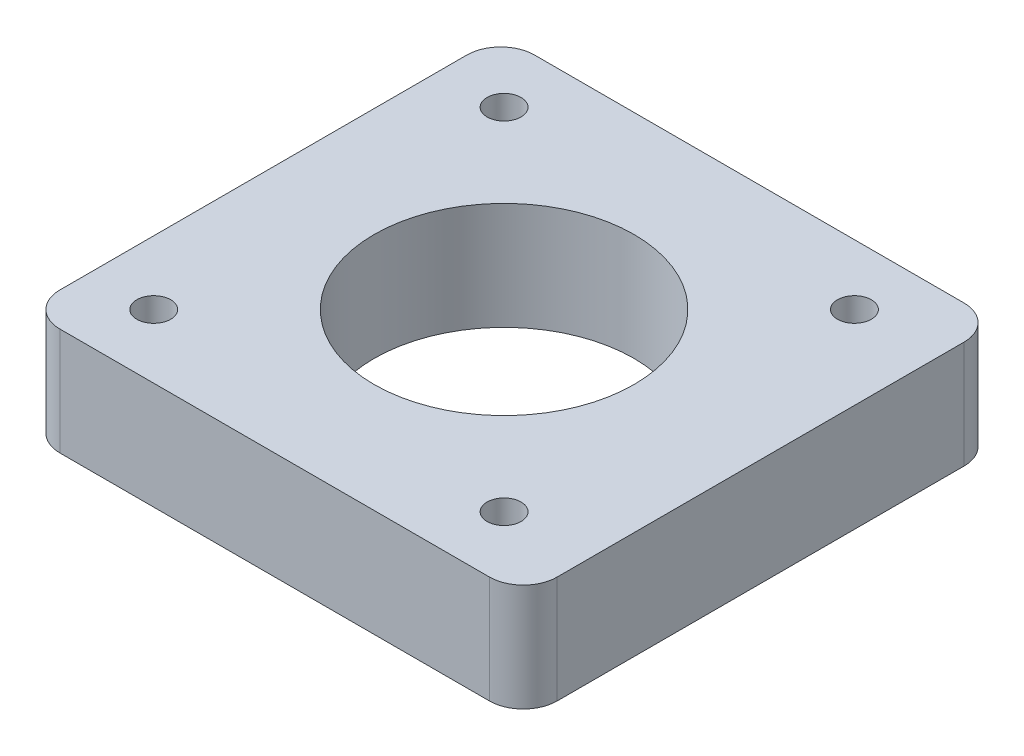
ISO-10303-21;
HEADER;
FILE_DESCRIPTION(('STEP AP214'),'2;1');
FILE_NAME('part.step','',(''),(''),'','','');
FILE_SCHEMA(('AUTOMOTIVE_DESIGN { 1 0 10303 214 1 1 1 1 }'));
ENDSEC;
DATA;
#1=APPLICATION_CONTEXT('core data for automotive mechanical design processes');
#2=APPLICATION_PROTOCOL_DEFINITION('international standard','automotive_design',2000,#1);
#3=PRODUCT_CONTEXT('',#1,'mechanical');
#4=PRODUCT('Part','Part','',(#3));
#5=PRODUCT_RELATED_PRODUCT_CATEGORY('part','',(#4));
#6=PRODUCT_DEFINITION_FORMATION('','',#4);
#7=PRODUCT_DEFINITION_CONTEXT('part definition',#1,'design');
#8=PRODUCT_DEFINITION('design','',#6,#7);
#9=PRODUCT_DEFINITION_SHAPE('','',#8);
#10=(LENGTH_UNIT() NAMED_UNIT(*) SI_UNIT(.MILLI.,.METRE.));
#11=(NAMED_UNIT(*) PLANE_ANGLE_UNIT() SI_UNIT($,.RADIAN.));
#12=(NAMED_UNIT(*) SI_UNIT($,.STERADIAN.) SOLID_ANGLE_UNIT());
#13=UNCERTAINTY_MEASURE_WITH_UNIT(LENGTH_MEASURE(1.E-05),#10,'distance_accuracy_value','');
#14=(GEOMETRIC_REPRESENTATION_CONTEXT(3) GLOBAL_UNCERTAINTY_ASSIGNED_CONTEXT((#13)) GLOBAL_UNIT_ASSIGNED_CONTEXT((#10,
#11,#12)) REPRESENTATION_CONTEXT('',''));
#15=CARTESIAN_POINT('',(0.,0.,0.));
#16=DIRECTION('',(0.,0.,1.));
#17=DIRECTION('',(1.,0.,0.));
#18=AXIS2_PLACEMENT_3D('',#15,#16,#17);
#19=CARTESIAN_POINT('',(0.,9.5,0.));
#20=DIRECTION('',(1.,0.,0.));
#21=DIRECTION('',(0.,0.,-1.));
#22=AXIS2_PLACEMENT_3D('',#19,#20,#21);
#23=PLANE('',#22);
#24=DIRECTION('',(0.,0.,1.));
#25=VECTOR('',#24,1.);
#26=CARTESIAN_POINT('',(0.,9.5,0.));
#27=LINE('',#26,#25);
#28=CARTESIAN_POINT('',(0.,9.5,3.));
#29=VERTEX_POINT('',#28);
#30=CARTESIAN_POINT('',(0.,9.5,39.));
#31=VERTEX_POINT('',#30);
#32=EDGE_CURVE('E127',#29,#31,#27,.T.);
#33=ORIENTED_EDGE('',*,*,#32,.F.);
#34=DIRECTION('',(0.,-1.,0.));
#35=VECTOR('',#34,1.);
#36=CARTESIAN_POINT('',(0.,9.5,3.));
#37=LINE('',#36,#35);
#38=CARTESIAN_POINT('',(0.,0.,3.));
#39=VERTEX_POINT('',#38);
#40=EDGE_CURVE('E153',#29,#39,#37,.T.);
#41=ORIENTED_EDGE('',*,*,#40,.T.);
#42=DIRECTION('',(0.,0.,1.));
#43=VECTOR('',#42,1.);
#44=CARTESIAN_POINT('',(0.,0.,0.));
#45=LINE('',#44,#43);
#46=CARTESIAN_POINT('',(0.,0.,39.));
#47=VERTEX_POINT('',#46);
#48=EDGE_CURVE('E159',#39,#47,#45,.T.);
#49=ORIENTED_EDGE('',*,*,#48,.T.);
#50=DIRECTION('',(0.,-1.,0.));
#51=VECTOR('',#50,1.);
#52=CARTESIAN_POINT('',(0.,9.5,39.));
#53=LINE('',#52,#51);
#54=EDGE_CURVE('E151',#47,#31,#53,.F.);
#55=ORIENTED_EDGE('',*,*,#54,.T.);
#56=EDGE_LOOP('',(#33,#41,#49,#55));
#57=FACE_BOUND('',#56,.T.);
#58=ADVANCED_FACE('F35',(#57),#23,.F.);
#59=CARTESIAN_POINT('',(0.,9.5,42.));
#60=DIRECTION('',(0.,0.,-1.));
#61=DIRECTION('',(-1.,0.,0.));
#62=AXIS2_PLACEMENT_3D('',#59,#60,#61);
#63=PLANE('',#62);
#64=DIRECTION('',(1.,0.,0.));
#65=VECTOR('',#64,1.);
#66=CARTESIAN_POINT('',(0.,9.5,42.));
#67=LINE('',#66,#65);
#68=CARTESIAN_POINT('',(3.,9.5,42.));
#69=VERTEX_POINT('',#68);
#70=CARTESIAN_POINT('',(41.,9.5,42.));
#71=VERTEX_POINT('',#70);
#72=EDGE_CURVE('E130',#69,#71,#67,.T.);
#73=ORIENTED_EDGE('',*,*,#72,.F.);
#74=DIRECTION('',(0.,-1.,0.));
#75=VECTOR('',#74,1.);
#76=CARTESIAN_POINT('',(3.,9.5,42.));
#77=LINE('',#76,#75);
#78=CARTESIAN_POINT('',(3.,0.,42.));
#79=VERTEX_POINT('',#78);
#80=EDGE_CURVE('E11',#69,#79,#77,.T.);
#81=ORIENTED_EDGE('',*,*,#80,.T.);
#82=DIRECTION('',(1.,0.,0.));
#83=VECTOR('',#82,1.);
#84=CARTESIAN_POINT('',(0.,0.,42.));
#85=LINE('',#84,#83);
#86=CARTESIAN_POINT('',(41.,0.,42.));
#87=VERTEX_POINT('',#86);
#88=EDGE_CURVE('E132',#79,#87,#85,.T.);
#89=ORIENTED_EDGE('',*,*,#88,.T.);
#90=DIRECTION('',(0.,-1.,0.));
#91=VECTOR('',#90,1.);
#92=CARTESIAN_POINT('',(41.,9.5,42.));
#93=LINE('',#92,#91);
#94=EDGE_CURVE('E43',#87,#71,#93,.F.);
#95=ORIENTED_EDGE('',*,*,#94,.T.);
#96=EDGE_LOOP('',(#73,#81,#89,#95));
#97=FACE_BOUND('',#96,.T.);
#98=ADVANCED_FACE('F236',(#97),#63,.F.);
#99=CARTESIAN_POINT('',(44.,9.5,0.));
#100=DIRECTION('',(-1.,0.,0.));
#101=DIRECTION('',(0.,0.,1.));
#102=AXIS2_PLACEMENT_3D('',#99,#100,#101);
#103=PLANE('',#102);
#104=DIRECTION('',(0.,0.,-1.));
#105=VECTOR('',#104,1.);
#106=CARTESIAN_POINT('',(44.,0.,0.));
#107=LINE('',#106,#105);
#108=CARTESIAN_POINT('',(44.,0.,39.));
#109=VERTEX_POINT('',#108);
#110=CARTESIAN_POINT('',(44.,0.,3.));
#111=VERTEX_POINT('',#110);
#112=EDGE_CURVE('E128',#109,#111,#107,.T.);
#113=ORIENTED_EDGE('',*,*,#112,.T.);
#114=DIRECTION('',(0.,-1.,0.));
#115=VECTOR('',#114,1.);
#116=CARTESIAN_POINT('',(44.,9.5,3.));
#117=LINE('',#116,#115);
#118=CARTESIAN_POINT('',(44.,9.5,3.));
#119=VERTEX_POINT('',#118);
#120=EDGE_CURVE('E106',#111,#119,#117,.F.);
#121=ORIENTED_EDGE('',*,*,#120,.T.);
#122=DIRECTION('',(0.,0.,-1.));
#123=VECTOR('',#122,1.);
#124=CARTESIAN_POINT('',(44.,9.5,0.));
#125=LINE('',#124,#123);
#126=CARTESIAN_POINT('',(44.,9.5,39.));
#127=VERTEX_POINT('',#126);
#128=EDGE_CURVE('E171',#127,#119,#125,.T.);
#129=ORIENTED_EDGE('',*,*,#128,.F.);
#130=DIRECTION('',(0.,-1.,0.));
#131=VECTOR('',#130,1.);
#132=CARTESIAN_POINT('',(44.,9.5,39.));
#133=LINE('',#132,#131);
#134=EDGE_CURVE('E111',#127,#109,#133,.T.);
#135=ORIENTED_EDGE('',*,*,#134,.T.);
#136=EDGE_LOOP('',(#113,#121,#129,#135));
#137=FACE_BOUND('',#136,.T.);
#138=ADVANCED_FACE('F234',(#137),#103,.F.);
#139=CARTESIAN_POINT('',(0.,9.5,0.));
#140=DIRECTION('',(0.,0.,1.));
#141=DIRECTION('',(1.,0.,0.));
#142=AXIS2_PLACEMENT_3D('',#139,#140,#141);
#143=PLANE('',#142);
#144=DIRECTION('',(-1.,0.,0.));
#145=VECTOR('',#144,1.);
#146=CARTESIAN_POINT('',(0.,9.5,0.));
#147=LINE('',#146,#145);
#148=CARTESIAN_POINT('',(41.,9.5,0.));
#149=VERTEX_POINT('',#148);
#150=CARTESIAN_POINT('',(3.,9.5,0.));
#151=VERTEX_POINT('',#150);
#152=EDGE_CURVE('E121',#149,#151,#147,.T.);
#153=ORIENTED_EDGE('',*,*,#152,.F.);
#154=DIRECTION('',(0.,-1.,0.));
#155=VECTOR('',#154,1.);
#156=CARTESIAN_POINT('',(41.,9.5,0.));
#157=LINE('',#156,#155);
#158=CARTESIAN_POINT('',(41.,0.,0.));
#159=VERTEX_POINT('',#158);
#160=EDGE_CURVE('E105',#149,#159,#157,.T.);
#161=ORIENTED_EDGE('',*,*,#160,.T.);
#162=DIRECTION('',(-1.,0.,0.));
#163=VECTOR('',#162,1.);
#164=CARTESIAN_POINT('',(0.,0.,0.));
#165=LINE('',#164,#163);
#166=CARTESIAN_POINT('',(3.,0.,0.));
#167=VERTEX_POINT('',#166);
#168=EDGE_CURVE('E118',#159,#167,#165,.T.);
#169=ORIENTED_EDGE('',*,*,#168,.T.);
#170=DIRECTION('',(0.,-1.,0.));
#171=VECTOR('',#170,1.);
#172=CARTESIAN_POINT('',(3.,9.5,0.));
#173=LINE('',#172,#171);
#174=EDGE_CURVE('E123',#167,#151,#173,.F.);
#175=ORIENTED_EDGE('',*,*,#174,.T.);
#176=EDGE_LOOP('',(#153,#161,#169,#175));
#177=FACE_BOUND('',#176,.T.);
#178=ADVANCED_FACE('F117',(#177),#143,.F.);
#179=CARTESIAN_POINT('',(0.,9.5,0.));
#180=DIRECTION('',(0.,1.,0.));
#181=DIRECTION('',(0.,0.,1.));
#182=AXIS2_PLACEMENT_3D('',#179,#180,#181);
#183=PLANE('',#182);
#184=CARTESIAN_POINT('',(36.65,9.5,5.34999999999999));
#185=DIRECTION('',(0.,-1.,0.));
#186=DIRECTION('',(0.,0.,-1.));
#187=AXIS2_PLACEMENT_3D('',#184,#185,#186);
#188=CIRCLE('',#187,1.5);
#189=CARTESIAN_POINT('',(36.65,9.5,3.84999999999999));
#190=VERTEX_POINT('',#189);
#191=EDGE_CURVE('E187',#190,#190,#188,.T.);
#192=ORIENTED_EDGE('',*,*,#191,.T.);
#193=EDGE_LOOP('',(#192));
#194=FACE_BOUND('',#193,.T.);
#195=CARTESIAN_POINT('',(5.65,9.5,5.35000000000088));
#196=DIRECTION('',(0.,-1.,0.));
#197=DIRECTION('',(0.,0.,-1.));
#198=AXIS2_PLACEMENT_3D('',#195,#196,#197);
#199=CIRCLE('',#198,1.5);
#200=CARTESIAN_POINT('',(5.65,9.5,3.85000000000088));
#201=VERTEX_POINT('',#200);
#202=EDGE_CURVE('E193',#201,#201,#199,.T.);
#203=ORIENTED_EDGE('',*,*,#202,.T.);
#204=EDGE_LOOP('',(#203));
#205=FACE_BOUND('',#204,.T.);
#206=CARTESIAN_POINT('',(5.65000000000089,9.5,36.3500000000009));
#207=DIRECTION('',(0.,-1.,0.));
#208=DIRECTION('',(0.,0.,-1.));
#209=AXIS2_PLACEMENT_3D('',#206,#207,#208);
#210=CIRCLE('',#209,1.5);
#211=CARTESIAN_POINT('',(5.65000000000089,9.5,34.8500000000009));
#212=VERTEX_POINT('',#211);
#213=EDGE_CURVE('E181',#212,#212,#210,.T.);
#214=ORIENTED_EDGE('',*,*,#213,.T.);
#215=EDGE_LOOP('',(#214));
#216=FACE_BOUND('',#215,.T.);
#217=CARTESIAN_POINT('',(36.6500000000009,9.5,36.35));
#218=DIRECTION('',(0.,-1.,0.));
#219=DIRECTION('',(0.,0.,-1.));
#220=AXIS2_PLACEMENT_3D('',#217,#218,#219);
#221=CIRCLE('',#220,1.5);
#222=CARTESIAN_POINT('',(36.6500000000009,9.5,34.85));
#223=VERTEX_POINT('',#222);
#224=EDGE_CURVE('E176',#223,#223,#221,.T.);
#225=ORIENTED_EDGE('',*,*,#224,.T.);
#226=EDGE_LOOP('',(#225));
#227=FACE_BOUND('',#226,.T.);
#228=CARTESIAN_POINT('',(21.1499999999992,9.5,20.8499999999997));
#229=DIRECTION('',(0.,1.,0.));
#230=DIRECTION('',(0.,0.,1.));
#231=AXIS2_PLACEMENT_3D('',#228,#229,#230);
#232=CIRCLE('',#231,11.5);
#233=CARTESIAN_POINT('',(21.1499999999992,9.5,32.3499999999997));
#234=VERTEX_POINT('',#233);
#235=EDGE_CURVE('E167',#234,#234,#232,.T.);
#236=ORIENTED_EDGE('',*,*,#235,.F.);
#237=EDGE_LOOP('',(#236));
#238=FACE_BOUND('',#237,.T.);
#239=ORIENTED_EDGE('',*,*,#128,.T.);
#240=CARTESIAN_POINT('',(41.,9.5,3.));
#241=DIRECTION('',(0.,1.,0.));
#242=DIRECTION('',(0.,0.,1.));
#243=AXIS2_PLACEMENT_3D('',#240,#241,#242);
#244=CIRCLE('',#243,3.);
#245=EDGE_CURVE('E149',#119,#149,#244,.T.);
#246=ORIENTED_EDGE('',*,*,#245,.T.);
#247=ORIENTED_EDGE('',*,*,#152,.T.);
#248=CARTESIAN_POINT('',(3.,9.5,3.));
#249=DIRECTION('',(0.,1.,0.));
#250=DIRECTION('',(0.,0.,1.));
#251=AXIS2_PLACEMENT_3D('',#248,#249,#250);
#252=CIRCLE('',#251,3.);
#253=EDGE_CURVE('E147',#151,#29,#252,.T.);
#254=ORIENTED_EDGE('',*,*,#253,.T.);
#255=ORIENTED_EDGE('',*,*,#32,.T.);
#256=CARTESIAN_POINT('',(3.,9.5,39.));
#257=DIRECTION('',(0.,1.,0.));
#258=DIRECTION('',(0.,0.,1.));
#259=AXIS2_PLACEMENT_3D('',#256,#257,#258);
#260=CIRCLE('',#259,3.);
#261=EDGE_CURVE('E56',#31,#69,#260,.T.);
#262=ORIENTED_EDGE('',*,*,#261,.T.);
#263=ORIENTED_EDGE('',*,*,#72,.T.);
#264=CARTESIAN_POINT('',(41.,9.5,39.));
#265=DIRECTION('',(0.,1.,0.));
#266=DIRECTION('',(0.,0.,1.));
#267=AXIS2_PLACEMENT_3D('',#264,#265,#266);
#268=CIRCLE('',#267,3.);
#269=EDGE_CURVE('E144',#71,#127,#268,.T.);
#270=ORIENTED_EDGE('',*,*,#269,.T.);
#271=EDGE_LOOP('',(#239,#246,#247,#254,#255,#262,#263,#270));
#272=FACE_BOUND('',#271,.T.);
#273=ADVANCED_FACE('F202',(#194,#205,#216,#227,#238,#272),#183,.T.);
#274=CARTESIAN_POINT('',(0.,0.,0.));
#275=DIRECTION('',(0.,1.,0.));
#276=DIRECTION('',(0.,0.,1.));
#277=AXIS2_PLACEMENT_3D('',#274,#275,#276);
#278=PLANE('',#277);
#279=CARTESIAN_POINT('',(36.65,0.,5.34999999999999));
#280=DIRECTION('',(0.,-1.,0.));
#281=DIRECTION('',(0.,0.,-1.));
#282=AXIS2_PLACEMENT_3D('',#279,#280,#281);
#283=CIRCLE('',#282,1.5);
#284=CARTESIAN_POINT('',(36.65,0.,3.84999999999999));
#285=VERTEX_POINT('',#284);
#286=EDGE_CURVE('E184',#285,#285,#283,.T.);
#287=ORIENTED_EDGE('',*,*,#286,.F.);
#288=EDGE_LOOP('',(#287));
#289=FACE_BOUND('',#288,.T.);
#290=CARTESIAN_POINT('',(5.65,0.,5.35000000000088));
#291=DIRECTION('',(0.,-1.,0.));
#292=DIRECTION('',(0.,0.,-1.));
#293=AXIS2_PLACEMENT_3D('',#290,#291,#292);
#294=CIRCLE('',#293,1.5);
#295=CARTESIAN_POINT('',(5.65,0.,3.85000000000088));
#296=VERTEX_POINT('',#295);
#297=EDGE_CURVE('E190',#296,#296,#294,.T.);
#298=ORIENTED_EDGE('',*,*,#297,.F.);
#299=EDGE_LOOP('',(#298));
#300=FACE_BOUND('',#299,.T.);
#301=CARTESIAN_POINT('',(5.65000000000089,0.,36.3500000000009));
#302=DIRECTION('',(0.,-1.,0.));
#303=DIRECTION('',(0.,0.,-1.));
#304=AXIS2_PLACEMENT_3D('',#301,#302,#303);
#305=CIRCLE('',#304,1.5);
#306=CARTESIAN_POINT('',(5.65000000000089,0.,34.8500000000009));
#307=VERTEX_POINT('',#306);
#308=EDGE_CURVE('E196',#307,#307,#305,.T.);
#309=ORIENTED_EDGE('',*,*,#308,.F.);
#310=EDGE_LOOP('',(#309));
#311=FACE_BOUND('',#310,.T.);
#312=CARTESIAN_POINT('',(36.6500000000009,0.,36.35));
#313=DIRECTION('',(0.,-1.,0.));
#314=DIRECTION('',(0.,0.,-1.));
#315=AXIS2_PLACEMENT_3D('',#312,#313,#314);
#316=CIRCLE('',#315,1.5);
#317=CARTESIAN_POINT('',(36.6500000000009,0.,34.85));
#318=VERTEX_POINT('',#317);
#319=EDGE_CURVE('E178',#318,#318,#316,.T.);
#320=ORIENTED_EDGE('',*,*,#319,.F.);
#321=EDGE_LOOP('',(#320));
#322=FACE_BOUND('',#321,.T.);
#323=CARTESIAN_POINT('',(21.1499999999992,0.,20.8499999999997));
#324=DIRECTION('',(0.,1.,0.));
#325=DIRECTION('',(0.,0.,1.));
#326=AXIS2_PLACEMENT_3D('',#323,#324,#325);
#327=CIRCLE('',#326,11.5);
#328=CARTESIAN_POINT('',(21.1499999999992,0.,32.3499999999997));
#329=VERTEX_POINT('',#328);
#330=EDGE_CURVE('E164',#329,#329,#327,.T.);
#331=ORIENTED_EDGE('',*,*,#330,.T.);
#332=EDGE_LOOP('',(#331));
#333=FACE_BOUND('',#332,.T.);
#334=ORIENTED_EDGE('',*,*,#168,.F.);
#335=CARTESIAN_POINT('',(41.,0.,3.));
#336=DIRECTION('',(0.,1.,0.));
#337=DIRECTION('',(0.,0.,1.));
#338=AXIS2_PLACEMENT_3D('',#335,#336,#337);
#339=CIRCLE('',#338,3.);
#340=EDGE_CURVE('E101',#159,#111,#339,.F.);
#341=ORIENTED_EDGE('',*,*,#340,.T.);
#342=ORIENTED_EDGE('',*,*,#112,.F.);
#343=CARTESIAN_POINT('',(41.,0.,39.));
#344=DIRECTION('',(0.,1.,0.));
#345=DIRECTION('',(0.,0.,1.));
#346=AXIS2_PLACEMENT_3D('',#343,#344,#345);
#347=CIRCLE('',#346,3.);
#348=EDGE_CURVE('E122',#109,#87,#347,.F.);
#349=ORIENTED_EDGE('',*,*,#348,.T.);
#350=ORIENTED_EDGE('',*,*,#88,.F.);
#351=CARTESIAN_POINT('',(3.,0.,39.));
#352=DIRECTION('',(0.,1.,0.));
#353=DIRECTION('',(0.,0.,1.));
#354=AXIS2_PLACEMENT_3D('',#351,#352,#353);
#355=CIRCLE('',#354,3.);
#356=EDGE_CURVE('E138',#79,#47,#355,.F.);
#357=ORIENTED_EDGE('',*,*,#356,.T.);
#358=ORIENTED_EDGE('',*,*,#48,.F.);
#359=CARTESIAN_POINT('',(3.,0.,3.));
#360=DIRECTION('',(0.,1.,0.));
#361=DIRECTION('',(0.,0.,1.));
#362=AXIS2_PLACEMENT_3D('',#359,#360,#361);
#363=CIRCLE('',#362,3.);
#364=EDGE_CURVE('E112',#39,#167,#363,.F.);
#365=ORIENTED_EDGE('',*,*,#364,.T.);
#366=EDGE_LOOP('',(#334,#341,#342,#349,#350,#357,#358,#365));
#367=FACE_BOUND('',#366,.T.);
#368=ADVANCED_FACE('F125',(#289,#300,#311,#322,#333,#367),#278,.F.);
#369=CARTESIAN_POINT('',(21.1499999999992,0.,20.8499999999997));
#370=DIRECTION('',(0.,1.,0.));
#371=DIRECTION('',(0.,0.,1.));
#372=AXIS2_PLACEMENT_3D('',#369,#370,#371);
#373=CYLINDRICAL_SURFACE('',#372,11.5);
#374=ORIENTED_EDGE('',*,*,#330,.F.);
#375=EDGE_LOOP('',(#374));
#376=FACE_BOUND('',#375,.T.);
#377=ORIENTED_EDGE('',*,*,#235,.T.);
#378=EDGE_LOOP('',(#377));
#379=FACE_BOUND('',#378,.T.);
#380=ADVANCED_FACE('F215',(#376,#379),#373,.F.);
#381=CARTESIAN_POINT('',(41.,9.5,3.));
#382=DIRECTION('',(0.,-1.,0.));
#383=DIRECTION('',(0.,0.,-1.));
#384=AXIS2_PLACEMENT_3D('',#381,#382,#383);
#385=CYLINDRICAL_SURFACE('',#384,3.);
#386=ORIENTED_EDGE('',*,*,#245,.F.);
#387=ORIENTED_EDGE('',*,*,#120,.F.);
#388=ORIENTED_EDGE('',*,*,#340,.F.);
#389=ORIENTED_EDGE('',*,*,#160,.F.);
#390=EDGE_LOOP('',(#386,#387,#388,#389));
#391=FACE_BOUND('',#390,.T.);
#392=ADVANCED_FACE('F104',(#391),#385,.T.);
#393=CARTESIAN_POINT('',(3.,9.5,3.));
#394=DIRECTION('',(0.,-1.,0.));
#395=DIRECTION('',(0.,0.,-1.));
#396=AXIS2_PLACEMENT_3D('',#393,#394,#395);
#397=CYLINDRICAL_SURFACE('',#396,3.);
#398=ORIENTED_EDGE('',*,*,#253,.F.);
#399=ORIENTED_EDGE('',*,*,#174,.F.);
#400=ORIENTED_EDGE('',*,*,#364,.F.);
#401=ORIENTED_EDGE('',*,*,#40,.F.);
#402=EDGE_LOOP('',(#398,#399,#400,#401));
#403=FACE_BOUND('',#402,.T.);
#404=ADVANCED_FACE('F240',(#403),#397,.T.);
#405=CARTESIAN_POINT('',(3.,9.5,39.));
#406=DIRECTION('',(0.,-1.,0.));
#407=DIRECTION('',(0.,0.,-1.));
#408=AXIS2_PLACEMENT_3D('',#405,#406,#407);
#409=CYLINDRICAL_SURFACE('',#408,3.);
#410=ORIENTED_EDGE('',*,*,#261,.F.);
#411=ORIENTED_EDGE('',*,*,#54,.F.);
#412=ORIENTED_EDGE('',*,*,#356,.F.);
#413=ORIENTED_EDGE('',*,*,#80,.F.);
#414=EDGE_LOOP('',(#410,#411,#412,#413));
#415=FACE_BOUND('',#414,.T.);
#416=ADVANCED_FACE('F239',(#415),#409,.T.);
#417=CARTESIAN_POINT('',(41.,9.5,39.));
#418=DIRECTION('',(0.,-1.,0.));
#419=DIRECTION('',(0.,0.,-1.));
#420=AXIS2_PLACEMENT_3D('',#417,#418,#419);
#421=CYLINDRICAL_SURFACE('',#420,3.);
#422=ORIENTED_EDGE('',*,*,#269,.F.);
#423=ORIENTED_EDGE('',*,*,#94,.F.);
#424=ORIENTED_EDGE('',*,*,#348,.F.);
#425=ORIENTED_EDGE('',*,*,#134,.F.);
#426=EDGE_LOOP('',(#422,#423,#424,#425));
#427=FACE_BOUND('',#426,.T.);
#428=ADVANCED_FACE('F37',(#427),#421,.T.);
#429=CARTESIAN_POINT('',(36.6500000000009,9.5,36.35));
#430=DIRECTION('',(0.,-1.,0.));
#431=DIRECTION('',(0.,0.,-1.));
#432=AXIS2_PLACEMENT_3D('',#429,#430,#431);
#433=CYLINDRICAL_SURFACE('',#432,1.5);
#434=ORIENTED_EDGE('',*,*,#224,.F.);
#435=EDGE_LOOP('',(#434));
#436=FACE_BOUND('',#435,.T.);
#437=ORIENTED_EDGE('',*,*,#319,.T.);
#438=EDGE_LOOP('',(#437));
#439=FACE_BOUND('',#438,.T.);
#440=ADVANCED_FACE('F209',(#436,#439),#433,.F.);
#441=CARTESIAN_POINT('',(5.65000000000089,9.5,36.3500000000009));
#442=DIRECTION('',(0.,-1.,0.));
#443=DIRECTION('',(0.,0.,-1.));
#444=AXIS2_PLACEMENT_3D('',#441,#442,#443);
#445=CYLINDRICAL_SURFACE('',#444,1.5);
#446=ORIENTED_EDGE('',*,*,#213,.F.);
#447=EDGE_LOOP('',(#446));
#448=FACE_BOUND('',#447,.T.);
#449=ORIENTED_EDGE('',*,*,#308,.T.);
#450=EDGE_LOOP('',(#449));
#451=FACE_BOUND('',#450,.T.);
#452=ADVANCED_FACE('F205',(#448,#451),#445,.F.);
#453=CARTESIAN_POINT('',(5.65,9.5,5.35000000000088));
#454=DIRECTION('',(0.,-1.,0.));
#455=DIRECTION('',(0.,0.,-1.));
#456=AXIS2_PLACEMENT_3D('',#453,#454,#455);
#457=CYLINDRICAL_SURFACE('',#456,1.5);
#458=ORIENTED_EDGE('',*,*,#202,.F.);
#459=EDGE_LOOP('',(#458));
#460=FACE_BOUND('',#459,.T.);
#461=ORIENTED_EDGE('',*,*,#297,.T.);
#462=EDGE_LOOP('',(#461));
#463=FACE_BOUND('',#462,.T.);
#464=ADVANCED_FACE('F208',(#460,#463),#457,.F.);
#465=CARTESIAN_POINT('',(36.65,9.5,5.34999999999999));
#466=DIRECTION('',(0.,-1.,0.));
#467=DIRECTION('',(0.,0.,-1.));
#468=AXIS2_PLACEMENT_3D('',#465,#466,#467);
#469=CYLINDRICAL_SURFACE('',#468,1.5);
#470=ORIENTED_EDGE('',*,*,#191,.F.);
#471=EDGE_LOOP('',(#470));
#472=FACE_BOUND('',#471,.T.);
#473=ORIENTED_EDGE('',*,*,#286,.T.);
#474=EDGE_LOOP('',(#473));
#475=FACE_BOUND('',#474,.T.);
#476=ADVANCED_FACE('F263',(#472,#475),#469,.F.);
#477=CLOSED_SHELL('',(#58,#98,#138,#178,#273,#368,#380,#392,#404,#416,#428,#440,#452,#464,#476));
#478=MANIFOLD_SOLID_BREP('B2',#477);
#479=ADVANCED_BREP_SHAPE_REPRESENTATION('',(#18,#478),#14);
#480=SHAPE_DEFINITION_REPRESENTATION(#9,#479);
ENDSEC;
END-ISO-10303-21;
